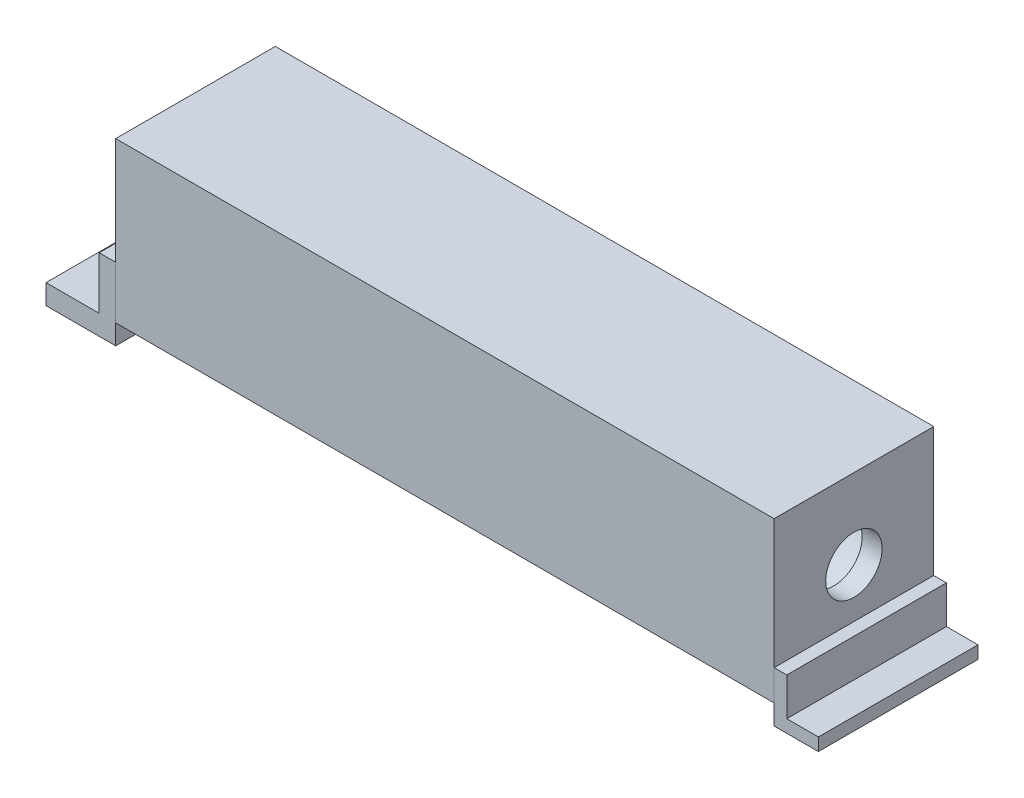
ISO-10303-21;
HEADER;
FILE_DESCRIPTION(('STEP AP214'),'2;1');
FILE_NAME('part.step','',(''),(''),'','','');
FILE_SCHEMA(('AUTOMOTIVE_DESIGN { 1 0 10303 214 1 1 1 1 }'));
ENDSEC;
DATA;
#1=APPLICATION_CONTEXT('core data for automotive mechanical design processes');
#2=APPLICATION_PROTOCOL_DEFINITION('international standard','automotive_design',2000,#1);
#3=PRODUCT_CONTEXT('',#1,'mechanical');
#4=PRODUCT('Part','Part','',(#3));
#5=PRODUCT_RELATED_PRODUCT_CATEGORY('part','',(#4));
#6=PRODUCT_DEFINITION_FORMATION('','',#4);
#7=PRODUCT_DEFINITION_CONTEXT('part definition',#1,'design');
#8=PRODUCT_DEFINITION('design','',#6,#7);
#9=PRODUCT_DEFINITION_SHAPE('','',#8);
#10=(LENGTH_UNIT() NAMED_UNIT(*) SI_UNIT(.MILLI.,.METRE.));
#11=(NAMED_UNIT(*) PLANE_ANGLE_UNIT() SI_UNIT($,.RADIAN.));
#12=(NAMED_UNIT(*) SI_UNIT($,.STERADIAN.) SOLID_ANGLE_UNIT());
#13=UNCERTAINTY_MEASURE_WITH_UNIT(LENGTH_MEASURE(1.E-05),#10,'distance_accuracy_value','');
#14=(GEOMETRIC_REPRESENTATION_CONTEXT(3) GLOBAL_UNCERTAINTY_ASSIGNED_CONTEXT((#13)) GLOBAL_UNIT_ASSIGNED_CONTEXT((#10,
#11,#12)) REPRESENTATION_CONTEXT('',''));
#15=CARTESIAN_POINT('',(0.,0.,0.));
#16=DIRECTION('',(0.,0.,1.));
#17=DIRECTION('',(1.,0.,0.));
#18=AXIS2_PLACEMENT_3D('',#15,#16,#17);
#19=CARTESIAN_POINT('',(610.,100.,130.));
#20=DIRECTION('',(0.,-1.,0.));
#21=DIRECTION('',(1.,0.,0.));
#22=AXIS2_PLACEMENT_3D('',#19,#20,#21);
#23=PLANE('',#22);
#24=DIRECTION('',(-1.,0.,0.));
#25=VECTOR('',#24,1.);
#26=CARTESIAN_POINT('',(621.0943429865,100.,130.));
#27=LINE('',#26,#25);
#28=CARTESIAN_POINT('',(632.188685973,100.,130.));
#29=VERTEX_POINT('',#28);
#30=CARTESIAN_POINT('',(610.,100.,130.));
#31=VERTEX_POINT('',#30);
#32=EDGE_CURVE('P0_E104',#29,#31,#27,.T.);
#33=ORIENTED_EDGE('',*,*,#32,.F.);
#34=DIRECTION('',(0.,0.,-1.));
#35=VECTOR('',#34,1.);
#36=CARTESIAN_POINT('',(632.188685973,100.,170.));
#37=LINE('',#36,#35);
#38=CARTESIAN_POINT('',(632.188685973,100.,210.));
#39=VERTEX_POINT('',#38);
#40=EDGE_CURVE('P0_E76',#39,#29,#37,.T.);
#41=ORIENTED_EDGE('',*,*,#40,.F.);
#42=DIRECTION('',(-1.,0.,0.));
#43=VECTOR('',#42,1.);
#44=CARTESIAN_POINT('',(621.0943429865,100.,210.));
#45=LINE('',#44,#43);
#46=CARTESIAN_POINT('',(610.,100.,210.));
#47=VERTEX_POINT('',#46);
#48=EDGE_CURVE('P0_E73',#39,#47,#45,.T.);
#49=ORIENTED_EDGE('',*,*,#48,.T.);
#50=DIRECTION('',(0.,0.,1.));
#51=VECTOR('',#50,1.);
#52=CARTESIAN_POINT('',(610.,100.,170.));
#53=LINE('',#52,#51);
#54=EDGE_CURVE('P0_E21',#31,#47,#53,.T.);
#55=ORIENTED_EDGE('',*,*,#54,.F.);
#56=EDGE_LOOP('',(#33,#41,#49,#55));
#57=FACE_BOUND('',#56,.T.);
#58=ADVANCED_FACE('P0_F17',(#57),#23,.T.);
#59=CARTESIAN_POINT('',(610.,100.,130.));
#60=DIRECTION('',(-1.,0.,0.));
#61=DIRECTION('',(0.,0.,1.));
#62=AXIS2_PLACEMENT_3D('',#59,#60,#61);
#63=PLANE('',#62);
#64=DIRECTION('',(0.,1.,0.));
#65=VECTOR('',#64,1.);
#66=CARTESIAN_POINT('',(610.,112.672595784,130.));
#67=LINE('',#66,#65);
#68=CARTESIAN_POINT('',(610.,125.345191568,130.));
#69=VERTEX_POINT('',#68);
#70=EDGE_CURVE('P0_E83',#31,#69,#67,.T.);
#71=ORIENTED_EDGE('',*,*,#70,.F.);
#72=ORIENTED_EDGE('',*,*,#54,.T.);
#73=DIRECTION('',(0.,1.,0.));
#74=VECTOR('',#73,1.);
#75=CARTESIAN_POINT('',(610.,112.672595784,210.));
#76=LINE('',#75,#74);
#77=CARTESIAN_POINT('',(610.,125.345191568,210.));
#78=VERTEX_POINT('',#77);
#79=EDGE_CURVE('P0_E68',#47,#78,#76,.T.);
#80=ORIENTED_EDGE('',*,*,#79,.T.);
#81=DIRECTION('',(0.,0.,1.));
#82=VECTOR('',#81,1.);
#83=CARTESIAN_POINT('',(610.,125.345191568,170.));
#84=LINE('',#83,#82);
#85=EDGE_CURVE('P0_E79',#69,#78,#84,.T.);
#86=ORIENTED_EDGE('',*,*,#85,.F.);
#87=EDGE_LOOP('',(#71,#72,#80,#86));
#88=FACE_BOUND('',#87,.T.);
#89=ADVANCED_FACE('P0_F81',(#88),#63,.T.);
#90=CARTESIAN_POINT('',(610.,125.345191568,130.));
#91=DIRECTION('',(0.,1.,0.));
#92=DIRECTION('',(0.,0.,1.));
#93=AXIS2_PLACEMENT_3D('',#90,#91,#92);
#94=PLANE('',#93);
#95=DIRECTION('',(1.,0.,0.));
#96=VECTOR('',#95,1.);
#97=CARTESIAN_POINT('',(621.0943429865,125.345191568,130.));
#98=LINE('',#97,#96);
#99=CARTESIAN_POINT('',(616.35580582031,125.345191568,130.));
#100=VERTEX_POINT('',#99);
#101=EDGE_CURVE('P0_E97',#69,#100,#98,.T.);
#102=ORIENTED_EDGE('',*,*,#101,.F.);
#103=ORIENTED_EDGE('',*,*,#85,.T.);
#104=DIRECTION('',(1.,0.,0.));
#105=VECTOR('',#104,1.);
#106=CARTESIAN_POINT('',(621.0943429865,125.345191568,210.));
#107=LINE('',#106,#105);
#108=CARTESIAN_POINT('',(616.35580582031,125.345191568,210.));
#109=VERTEX_POINT('',#108);
#110=EDGE_CURVE('P0_E88',#78,#109,#107,.T.);
#111=ORIENTED_EDGE('',*,*,#110,.T.);
#112=DIRECTION('',(0.,0.,1.));
#113=VECTOR('',#112,1.);
#114=CARTESIAN_POINT('',(616.355805816,125.345191568,170.));
#115=LINE('',#114,#113);
#116=EDGE_CURVE('P0_E99',#100,#109,#115,.T.);
#117=ORIENTED_EDGE('',*,*,#116,.F.);
#118=EDGE_LOOP('',(#102,#103,#111,#117));
#119=FACE_BOUND('',#118,.T.);
#120=ADVANCED_FACE('P0_F95',(#119),#94,.T.);
#121=CARTESIAN_POINT('',(632.188685973,100.,210.));
#122=DIRECTION('',(0.,0.,-1.));
#123=DIRECTION('',(-1.,0.,0.));
#124=AXIS2_PLACEMENT_3D('',#121,#122,#123);
#125=PLANE('',#124);
#126=DIRECTION('',(0.,-1.,0.));
#127=VECTOR('',#126,1.);
#128=CARTESIAN_POINT('',(616.355805816,115.8491235195,210.));
#129=LINE('',#128,#127);
#130=CARTESIAN_POINT('',(616.35580582031,106.353055472345,210.));
#131=VERTEX_POINT('',#130);
#132=EDGE_CURVE('P0_E100',#109,#131,#129,.T.);
#133=ORIENTED_EDGE('',*,*,#132,.F.);
#134=ORIENTED_EDGE('',*,*,#110,.F.);
#135=ORIENTED_EDGE('',*,*,#79,.F.);
#136=ORIENTED_EDGE('',*,*,#48,.F.);
#137=DIRECTION('',(0.,-1.,0.));
#138=VECTOR('',#137,1.);
#139=CARTESIAN_POINT('',(632.188685973,103.1765277355,210.));
#140=LINE('',#139,#138);
#141=CARTESIAN_POINT('',(632.188685973,106.353055472345,210.));
#142=VERTEX_POINT('',#141);
#143=EDGE_CURVE('P0_E90',#142,#39,#140,.T.);
#144=ORIENTED_EDGE('',*,*,#143,.F.);
#145=DIRECTION('',(1.,0.,0.));
#146=VECTOR('',#145,1.);
#147=CARTESIAN_POINT('',(624.2722458945,106.353055471,210.));
#148=LINE('',#147,#146);
#149=EDGE_CURVE('P0_E117',#131,#142,#148,.T.);
#150=ORIENTED_EDGE('',*,*,#149,.F.);
#151=EDGE_LOOP('',(#133,#134,#135,#136,#144,#150));
#152=FACE_BOUND('',#151,.T.);
#153=ADVANCED_FACE('P0_F87',(#152),#125,.F.);
#154=CARTESIAN_POINT('',(632.188685973,100.,210.));
#155=DIRECTION('',(1.,0.,0.));
#156=DIRECTION('',(0.,0.,-1.));
#157=AXIS2_PLACEMENT_3D('',#154,#155,#156);
#158=PLANE('',#157);
#159=DIRECTION('',(0.,-1.,0.));
#160=VECTOR('',#159,1.);
#161=CARTESIAN_POINT('',(632.188685973,112.672595784,130.));
#162=LINE('',#161,#160);
#163=CARTESIAN_POINT('',(632.188685973,106.353055471672,130.));
#164=VERTEX_POINT('',#163);
#165=EDGE_CURVE('P0_E106',#164,#29,#162,.T.);
#166=ORIENTED_EDGE('',*,*,#165,.F.);
#167=DIRECTION('',(0.,0.,-1.));
#168=VECTOR('',#167,1.);
#169=CARTESIAN_POINT('',(632.188685973,106.353055471,170.));
#170=LINE('',#169,#168);
#171=EDGE_CURVE('P0_E115',#142,#164,#170,.T.);
#172=ORIENTED_EDGE('',*,*,#171,.F.);
#173=ORIENTED_EDGE('',*,*,#143,.T.);
#174=ORIENTED_EDGE('',*,*,#40,.T.);
#175=EDGE_LOOP('',(#166,#172,#173,#174));
#176=FACE_BOUND('',#175,.T.);
#177=ADVANCED_FACE('P0_F113',(#176),#158,.T.);
#178=CARTESIAN_POINT('',(632.188685973,100.,130.));
#179=DIRECTION('',(0.,0.,-1.));
#180=DIRECTION('',(-1.,0.,0.));
#181=AXIS2_PLACEMENT_3D('',#178,#179,#180);
#182=PLANE('',#181);
#183=ORIENTED_EDGE('',*,*,#101,.T.);
#184=DIRECTION('',(0.,1.,0.));
#185=VECTOR('',#184,1.);
#186=CARTESIAN_POINT('',(616.355805816,115.8491235195,130.));
#187=LINE('',#186,#185);
#188=CARTESIAN_POINT('',(616.35580582031,106.353055472345,130.));
#189=VERTEX_POINT('',#188);
#190=EDGE_CURVE('P0_E36',#189,#100,#187,.T.);
#191=ORIENTED_EDGE('',*,*,#190,.F.);
#192=DIRECTION('',(-1.,0.,0.));
#193=VECTOR('',#192,1.);
#194=CARTESIAN_POINT('',(624.2722458945,106.353055471,130.));
#195=LINE('',#194,#193);
#196=EDGE_CURVE('P0_E27',#164,#189,#195,.T.);
#197=ORIENTED_EDGE('',*,*,#196,.F.);
#198=ORIENTED_EDGE('',*,*,#165,.T.);
#199=ORIENTED_EDGE('',*,*,#32,.T.);
#200=ORIENTED_EDGE('',*,*,#70,.T.);
#201=EDGE_LOOP('',(#183,#191,#197,#198,#199,#200));
#202=FACE_BOUND('',#201,.T.);
#203=ADVANCED_FACE('P0_F102',(#202),#182,.T.);
#204=CARTESIAN_POINT('',(616.355805816,106.353055471,210.));
#205=DIRECTION('',(1.,0.,0.));
#206=DIRECTION('',(0.,0.,-1.));
#207=AXIS2_PLACEMENT_3D('',#204,#205,#206);
#208=PLANE('',#207);
#209=ORIENTED_EDGE('',*,*,#190,.T.);
#210=ORIENTED_EDGE('',*,*,#116,.T.);
#211=ORIENTED_EDGE('',*,*,#132,.T.);
#212=DIRECTION('',(0.,0.,1.));
#213=VECTOR('',#212,1.);
#214=CARTESIAN_POINT('',(616.355805816,106.353055471,170.));
#215=LINE('',#214,#213);
#216=EDGE_CURVE('P0_E11',#189,#131,#215,.T.);
#217=ORIENTED_EDGE('',*,*,#216,.F.);
#218=EDGE_LOOP('',(#209,#210,#211,#217));
#219=FACE_BOUND('',#218,.T.);
#220=ADVANCED_FACE('P0_F122',(#219),#208,.T.);
#221=CARTESIAN_POINT('',(616.355805816,106.353055471,130.));
#222=DIRECTION('',(0.,1.,0.));
#223=DIRECTION('',(0.,0.,1.));
#224=AXIS2_PLACEMENT_3D('',#221,#222,#223);
#225=PLANE('',#224);
#226=ORIENTED_EDGE('',*,*,#196,.T.);
#227=ORIENTED_EDGE('',*,*,#216,.T.);
#228=ORIENTED_EDGE('',*,*,#149,.T.);
#229=ORIENTED_EDGE('',*,*,#171,.T.);
#230=EDGE_LOOP('',(#226,#227,#228,#229));
#231=FACE_BOUND('',#230,.T.);
#232=ADVANCED_FACE('P0_F19',(#231),#225,.T.);
#233=CLOSED_SHELL('',(#58,#89,#120,#153,#177,#203,#220,#232));
#234=MANIFOLD_SOLID_BREP('P0_B1',#233);
#235=CARTESIAN_POINT('',(245.056426343,110.,130.));
#236=DIRECTION('',(0.,-1.,0.));
#237=DIRECTION('',(1.,0.,0.));
#238=AXIS2_PLACEMENT_3D('',#235,#236,#237);
#239=PLANE('',#238);
#240=DIRECTION('',(0.,0.,-1.));
#241=VECTOR('',#240,1.);
#242=CARTESIAN_POINT('',(271.738370692,110.,170.));
#243=LINE('',#242,#241);
#244=CARTESIAN_POINT('',(271.738370691849,109.999999996395,210.));
#245=VERTEX_POINT('',#244);
#246=CARTESIAN_POINT('',(271.738370691849,109.999999996395,130.));
#247=VERTEX_POINT('',#246);
#248=EDGE_CURVE('P1_E73',#245,#247,#243,.T.);
#249=ORIENTED_EDGE('',*,*,#248,.T.);
#250=DIRECTION('',(-1.,0.,0.));
#251=VECTOR('',#250,1.);
#252=CARTESIAN_POINT('',(262.5282131715,109.999999985582,130.));
#253=LINE('',#252,#251);
#254=CARTESIAN_POINT('',(245.056426343,109.999999996395,130.));
#255=VERTEX_POINT('',#254);
#256=EDGE_CURVE('P1_E75',#247,#255,#253,.T.);
#257=ORIENTED_EDGE('',*,*,#256,.T.);
#258=DIRECTION('',(0.,0.,1.));
#259=VECTOR('',#258,1.);
#260=CARTESIAN_POINT('',(245.056426343,110.,170.));
#261=LINE('',#260,#259);
#262=CARTESIAN_POINT('',(245.056426343,109.999999996395,210.));
#263=VERTEX_POINT('',#262);
#264=EDGE_CURVE('P1_E21',#255,#263,#261,.T.);
#265=ORIENTED_EDGE('',*,*,#264,.T.);
#266=DIRECTION('',(-1.,0.,0.));
#267=VECTOR('',#266,1.);
#268=CARTESIAN_POINT('',(262.5282131715,109.999999985582,210.));
#269=LINE('',#268,#267);
#270=EDGE_CURVE('P1_E76',#245,#263,#269,.T.);
#271=ORIENTED_EDGE('',*,*,#270,.F.);
#272=EDGE_LOOP('',(#249,#257,#265,#271));
#273=FACE_BOUND('',#272,.T.);
#274=ADVANCED_FACE('P1_F17',(#273),#239,.F.);
#275=CARTESIAN_POINT('',(245.056426343,100.,210.));
#276=DIRECTION('',(1.,0.,0.));
#277=DIRECTION('',(0.,0.,-1.));
#278=AXIS2_PLACEMENT_3D('',#275,#276,#277);
#279=PLANE('',#278);
#280=ORIENTED_EDGE('',*,*,#264,.F.);
#281=DIRECTION('',(0.,-1.,0.));
#282=VECTOR('',#281,1.);
#283=CARTESIAN_POINT('',(245.056426343,118.149067141,130.));
#284=LINE('',#283,#282);
#285=CARTESIAN_POINT('',(245.056426343,100.,130.));
#286=VERTEX_POINT('',#285);
#287=EDGE_CURVE('P1_E90',#255,#286,#284,.T.);
#288=ORIENTED_EDGE('',*,*,#287,.T.);
#289=DIRECTION('',(0.,0.,1.));
#290=VECTOR('',#289,1.);
#291=CARTESIAN_POINT('',(245.056426343,100.,170.));
#292=LINE('',#291,#290);
#293=CARTESIAN_POINT('',(245.056426343,100.,210.));
#294=VERTEX_POINT('',#293);
#295=EDGE_CURVE('P1_E82',#286,#294,#292,.T.);
#296=ORIENTED_EDGE('',*,*,#295,.T.);
#297=DIRECTION('',(0.,-1.,0.));
#298=VECTOR('',#297,1.);
#299=CARTESIAN_POINT('',(245.056426343,118.149067141,210.));
#300=LINE('',#299,#298);
#301=EDGE_CURVE('P1_E99',#263,#294,#300,.T.);
#302=ORIENTED_EDGE('',*,*,#301,.F.);
#303=EDGE_LOOP('',(#280,#288,#296,#302));
#304=FACE_BOUND('',#303,.T.);
#305=ADVANCED_FACE('P1_F100',(#304),#279,.F.);
#306=CARTESIAN_POINT('',(245.056426343,100.,130.));
#307=DIRECTION('',(0.,1.,0.));
#308=DIRECTION('',(0.,0.,1.));
#309=AXIS2_PLACEMENT_3D('',#306,#307,#308);
#310=PLANE('',#309);
#311=ORIENTED_EDGE('',*,*,#295,.F.);
#312=DIRECTION('',(1.,0.,0.));
#313=VECTOR('',#312,1.);
#314=CARTESIAN_POINT('',(262.5282131715,100.,130.));
#315=LINE('',#314,#313);
#316=CARTESIAN_POINT('',(280.,100.,130.));
#317=VERTEX_POINT('',#316);
#318=EDGE_CURVE('P1_E114',#286,#317,#315,.T.);
#319=ORIENTED_EDGE('',*,*,#318,.T.);
#320=DIRECTION('',(0.,0.,1.));
#321=VECTOR('',#320,1.);
#322=CARTESIAN_POINT('',(280.,100.,170.));
#323=LINE('',#322,#321);
#324=CARTESIAN_POINT('',(280.,100.,210.));
#325=VERTEX_POINT('',#324);
#326=EDGE_CURVE('P1_E109',#317,#325,#323,.T.);
#327=ORIENTED_EDGE('',*,*,#326,.T.);
#328=DIRECTION('',(1.,0.,0.));
#329=VECTOR('',#328,1.);
#330=CARTESIAN_POINT('',(262.5282131715,100.,210.));
#331=LINE('',#330,#329);
#332=EDGE_CURVE('P1_E101',#294,#325,#331,.T.);
#333=ORIENTED_EDGE('',*,*,#332,.F.);
#334=EDGE_LOOP('',(#311,#319,#327,#333));
#335=FACE_BOUND('',#334,.T.);
#336=ADVANCED_FACE('P1_F117',(#335),#310,.F.);
#337=CARTESIAN_POINT('',(271.738370692,110.,210.));
#338=DIRECTION('',(1.,0.,0.));
#339=DIRECTION('',(0.,0.,-1.));
#340=AXIS2_PLACEMENT_3D('',#337,#338,#339);
#341=PLANE('',#340);
#342=DIRECTION('',(0.,0.,-1.));
#343=VECTOR('',#342,1.);
#344=CARTESIAN_POINT('',(271.738370692,136.298134282,170.));
#345=LINE('',#344,#343);
#346=CARTESIAN_POINT('',(271.738370691849,136.298134282,210.));
#347=VERTEX_POINT('',#346);
#348=CARTESIAN_POINT('',(271.738370691849,136.298134282,130.));
#349=VERTEX_POINT('',#348);
#350=EDGE_CURVE('P1_E94',#347,#349,#345,.T.);
#351=ORIENTED_EDGE('',*,*,#350,.T.);
#352=DIRECTION('',(0.,-1.,0.));
#353=VECTOR('',#352,1.);
#354=CARTESIAN_POINT('',(271.738370691398,118.149067141,130.));
#355=LINE('',#354,#353);
#356=EDGE_CURVE('P1_E81',#349,#247,#355,.T.);
#357=ORIENTED_EDGE('',*,*,#356,.T.);
#358=ORIENTED_EDGE('',*,*,#248,.F.);
#359=DIRECTION('',(0.,-1.,0.));
#360=VECTOR('',#359,1.);
#361=CARTESIAN_POINT('',(271.738370691398,118.149067141,210.));
#362=LINE('',#361,#360);
#363=EDGE_CURVE('P1_E104',#347,#245,#362,.T.);
#364=ORIENTED_EDGE('',*,*,#363,.F.);
#365=EDGE_LOOP('',(#351,#357,#358,#364));
#366=FACE_BOUND('',#365,.T.);
#367=ADVANCED_FACE('P1_F93',(#366),#341,.F.);
#368=CARTESIAN_POINT('',(245.056426343,100.,130.));
#369=DIRECTION('',(0.,0.,1.));
#370=DIRECTION('',(1.,0.,0.));
#371=AXIS2_PLACEMENT_3D('',#368,#369,#370);
#372=PLANE('',#371);
#373=DIRECTION('',(0.,-1.,0.));
#374=VECTOR('',#373,1.);
#375=CARTESIAN_POINT('',(280.,118.149067141,130.));
#376=LINE('',#375,#374);
#377=CARTESIAN_POINT('',(280.,136.298134282,130.));
#378=VERTEX_POINT('',#377);
#379=EDGE_CURVE('P1_E112',#378,#317,#376,.T.);
#380=ORIENTED_EDGE('',*,*,#379,.T.);
#381=ORIENTED_EDGE('',*,*,#318,.F.);
#382=ORIENTED_EDGE('',*,*,#287,.F.);
#383=ORIENTED_EDGE('',*,*,#256,.F.);
#384=ORIENTED_EDGE('',*,*,#356,.F.);
#385=DIRECTION('',(1.,0.,0.));
#386=VECTOR('',#385,1.);
#387=CARTESIAN_POINT('',(275.869185346,136.298134282,130.));
#388=LINE('',#387,#386);
#389=EDGE_CURVE('P1_E122',#349,#378,#388,.T.);
#390=ORIENTED_EDGE('',*,*,#389,.T.);
#391=EDGE_LOOP('',(#380,#381,#382,#383,#384,#390));
#392=FACE_BOUND('',#391,.T.);
#393=ADVANCED_FACE('P1_F86',(#392),#372,.F.);
#394=CARTESIAN_POINT('',(280.,136.298134282,130.));
#395=DIRECTION('',(-1.,0.,0.));
#396=DIRECTION('',(0.,-1.,0.));
#397=AXIS2_PLACEMENT_3D('',#394,#395,#396);
#398=PLANE('',#397);
#399=ORIENTED_EDGE('',*,*,#326,.F.);
#400=ORIENTED_EDGE('',*,*,#379,.F.);
#401=DIRECTION('',(0.,0.,1.));
#402=VECTOR('',#401,1.);
#403=CARTESIAN_POINT('',(280.,136.298134282,170.));
#404=LINE('',#403,#402);
#405=CARTESIAN_POINT('',(280.,136.298134282,210.));
#406=VERTEX_POINT('',#405);
#407=EDGE_CURVE('P1_E27',#378,#406,#404,.T.);
#408=ORIENTED_EDGE('',*,*,#407,.T.);
#409=DIRECTION('',(0.,1.,0.));
#410=VECTOR('',#409,1.);
#411=CARTESIAN_POINT('',(280.,118.149067141,210.));
#412=LINE('',#411,#410);
#413=EDGE_CURVE('P1_E35',#325,#406,#412,.T.);
#414=ORIENTED_EDGE('',*,*,#413,.F.);
#415=EDGE_LOOP('',(#399,#400,#408,#414));
#416=FACE_BOUND('',#415,.T.);
#417=ADVANCED_FACE('P1_F119',(#416),#398,.F.);
#418=CARTESIAN_POINT('',(245.056426343,100.,210.));
#419=DIRECTION('',(0.,0.,1.));
#420=DIRECTION('',(1.,0.,0.));
#421=AXIS2_PLACEMENT_3D('',#418,#419,#420);
#422=PLANE('',#421);
#423=ORIENTED_EDGE('',*,*,#332,.T.);
#424=ORIENTED_EDGE('',*,*,#413,.T.);
#425=DIRECTION('',(-1.,0.,0.));
#426=VECTOR('',#425,1.);
#427=CARTESIAN_POINT('',(275.869185346,136.298134282,210.));
#428=LINE('',#427,#426);
#429=EDGE_CURVE('P1_E11',#406,#347,#428,.T.);
#430=ORIENTED_EDGE('',*,*,#429,.T.);
#431=ORIENTED_EDGE('',*,*,#363,.T.);
#432=ORIENTED_EDGE('',*,*,#270,.T.);
#433=ORIENTED_EDGE('',*,*,#301,.T.);
#434=EDGE_LOOP('',(#423,#424,#430,#431,#432,#433));
#435=FACE_BOUND('',#434,.T.);
#436=ADVANCED_FACE('P1_F127',(#435),#422,.T.);
#437=CARTESIAN_POINT('',(271.738370692,136.298134282,210.));
#438=DIRECTION('',(0.,-1.,0.));
#439=DIRECTION('',(0.,0.,-1.));
#440=AXIS2_PLACEMENT_3D('',#437,#438,#439);
#441=PLANE('',#440);
#442=ORIENTED_EDGE('',*,*,#407,.F.);
#443=ORIENTED_EDGE('',*,*,#389,.F.);
#444=ORIENTED_EDGE('',*,*,#350,.F.);
#445=ORIENTED_EDGE('',*,*,#429,.F.);
#446=EDGE_LOOP('',(#442,#443,#444,#445));
#447=FACE_BOUND('',#446,.T.);
#448=ADVANCED_FACE('P1_F19',(#447),#441,.F.);
#449=CLOSED_SHELL('',(#274,#305,#336,#367,#393,#417,#436,#448));
#450=MANIFOLD_SOLID_BREP('P1_B1',#449);
#451=CARTESIAN_POINT('',(280.,110.,210.));
#452=DIRECTION('',(1.,0.,0.));
#453=DIRECTION('',(0.,0.,-1.));
#454=AXIS2_PLACEMENT_3D('',#451,#452,#453);
#455=PLANE('',#454);
#456=DIRECTION('',(0.,0.,-1.));
#457=VECTOR('',#456,1.);
#458=CARTESIAN_POINT('',(280.,190.,170.));
#459=LINE('',#458,#457);
#460=CARTESIAN_POINT('',(280.,190.,210.));
#461=VERTEX_POINT('',#460);
#462=CARTESIAN_POINT('',(280.,190.,130.));
#463=VERTEX_POINT('',#462);
#464=EDGE_CURVE('P2_E99',#461,#463,#459,.T.);
#465=ORIENTED_EDGE('',*,*,#464,.T.);
#466=DIRECTION('',(0.,-1.,0.));
#467=VECTOR('',#466,1.);
#468=CARTESIAN_POINT('',(280.,150.,130.));
#469=LINE('',#468,#467);
#470=CARTESIAN_POINT('',(280.,110.,130.));
#471=VERTEX_POINT('',#470);
#472=EDGE_CURVE('P2_E75',#463,#471,#469,.T.);
#473=ORIENTED_EDGE('',*,*,#472,.T.);
#474=DIRECTION('',(0.,0.,1.));
#475=VECTOR('',#474,1.);
#476=CARTESIAN_POINT('',(280.,110.,170.));
#477=LINE('',#476,#475);
#478=CARTESIAN_POINT('',(280.,110.,210.));
#479=VERTEX_POINT('',#478);
#480=EDGE_CURVE('P2_E57',#471,#479,#477,.T.);
#481=ORIENTED_EDGE('',*,*,#480,.T.);
#482=DIRECTION('',(0.,1.,0.));
#483=VECTOR('',#482,1.);
#484=CARTESIAN_POINT('',(280.,150.,210.));
#485=LINE('',#484,#483);
#486=EDGE_CURVE('P2_E63',#479,#461,#485,.T.);
#487=ORIENTED_EDGE('',*,*,#486,.T.);
#488=EDGE_LOOP('',(#465,#473,#481,#487));
#489=FACE_BOUND('',#488,.T.);
#490=ADVANCED_FACE('P2_F17',(#489),#455,.F.);
#491=CARTESIAN_POINT('',(610.,110.,210.));
#492=DIRECTION('',(0.,0.,-1.));
#493=DIRECTION('',(-1.,0.,0.));
#494=AXIS2_PLACEMENT_3D('',#491,#492,#493);
#495=PLANE('',#494);
#496=ORIENTED_EDGE('',*,*,#486,.F.);
#497=DIRECTION('',(1.,0.,0.));
#498=VECTOR('',#497,1.);
#499=CARTESIAN_POINT('',(445.,110.,210.));
#500=LINE('',#499,#498);
#501=CARTESIAN_POINT('',(610.,110.,210.));
#502=VERTEX_POINT('',#501);
#503=EDGE_CURVE('P2_E66',#479,#502,#500,.T.);
#504=ORIENTED_EDGE('',*,*,#503,.T.);
#505=DIRECTION('',(0.,-1.,0.));
#506=VECTOR('',#505,1.);
#507=CARTESIAN_POINT('',(610.,150.,210.));
#508=LINE('',#507,#506);
#509=CARTESIAN_POINT('',(610.,190.,210.));
#510=VERTEX_POINT('',#509);
#511=EDGE_CURVE('P2_E95',#510,#502,#508,.T.);
#512=ORIENTED_EDGE('',*,*,#511,.F.);
#513=DIRECTION('',(-1.,0.,0.));
#514=VECTOR('',#513,1.);
#515=CARTESIAN_POINT('',(445.,190.,210.));
#516=LINE('',#515,#514);
#517=EDGE_CURVE('P2_E68',#510,#461,#516,.T.);
#518=ORIENTED_EDGE('',*,*,#517,.T.);
#519=EDGE_LOOP('',(#496,#504,#512,#518));
#520=FACE_BOUND('',#519,.T.);
#521=ADVANCED_FACE('P2_F64',(#520),#495,.F.);
#522=CARTESIAN_POINT('',(280.,110.,130.));
#523=DIRECTION('',(0.,1.,0.));
#524=DIRECTION('',(0.,0.,1.));
#525=AXIS2_PLACEMENT_3D('',#522,#523,#524);
#526=PLANE('',#525);
#527=ORIENTED_EDGE('',*,*,#480,.F.);
#528=DIRECTION('',(1.,0.,0.));
#529=VECTOR('',#528,1.);
#530=CARTESIAN_POINT('',(445.,110.,130.));
#531=LINE('',#530,#529);
#532=CARTESIAN_POINT('',(610.,110.,130.));
#533=VERTEX_POINT('',#532);
#534=EDGE_CURVE('P2_E102',#471,#533,#531,.T.);
#535=ORIENTED_EDGE('',*,*,#534,.T.);
#536=DIRECTION('',(0.,0.,-1.));
#537=VECTOR('',#536,1.);
#538=CARTESIAN_POINT('',(610.,110.,170.));
#539=LINE('',#538,#537);
#540=EDGE_CURVE('P2_E74',#502,#533,#539,.T.);
#541=ORIENTED_EDGE('',*,*,#540,.F.);
#542=ORIENTED_EDGE('',*,*,#503,.F.);
#543=EDGE_LOOP('',(#527,#535,#541,#542));
#544=FACE_BOUND('',#543,.T.);
#545=ADVANCED_FACE('P2_F73',(#544),#526,.F.);
#546=CARTESIAN_POINT('',(280.,110.,130.));
#547=DIRECTION('',(0.,0.,1.));
#548=DIRECTION('',(1.,0.,0.));
#549=AXIS2_PLACEMENT_3D('',#546,#547,#548);
#550=PLANE('',#549);
#551=ORIENTED_EDGE('',*,*,#472,.F.);
#552=DIRECTION('',(1.,0.,0.));
#553=VECTOR('',#552,1.);
#554=CARTESIAN_POINT('',(445.,190.,130.));
#555=LINE('',#554,#553);
#556=CARTESIAN_POINT('',(610.,190.,130.));
#557=VERTEX_POINT('',#556);
#558=EDGE_CURVE('P2_E97',#463,#557,#555,.T.);
#559=ORIENTED_EDGE('',*,*,#558,.T.);
#560=DIRECTION('',(0.,1.,0.));
#561=VECTOR('',#560,1.);
#562=CARTESIAN_POINT('',(610.,150.,130.));
#563=LINE('',#562,#561);
#564=EDGE_CURVE('P2_E36',#533,#557,#563,.T.);
#565=ORIENTED_EDGE('',*,*,#564,.F.);
#566=ORIENTED_EDGE('',*,*,#534,.F.);
#567=EDGE_LOOP('',(#551,#559,#565,#566));
#568=FACE_BOUND('',#567,.T.);
#569=ADVANCED_FACE('P2_F104',(#568),#550,.F.);
#570=CARTESIAN_POINT('',(280.,190.,210.));
#571=DIRECTION('',(0.,-1.,0.));
#572=DIRECTION('',(0.,0.,-1.));
#573=AXIS2_PLACEMENT_3D('',#570,#571,#572);
#574=PLANE('',#573);
#575=ORIENTED_EDGE('',*,*,#464,.F.);
#576=ORIENTED_EDGE('',*,*,#517,.F.);
#577=DIRECTION('',(0.,0.,1.));
#578=VECTOR('',#577,1.);
#579=CARTESIAN_POINT('',(610.,190.,170.));
#580=LINE('',#579,#578);
#581=EDGE_CURVE('P2_E87',#557,#510,#580,.T.);
#582=ORIENTED_EDGE('',*,*,#581,.F.);
#583=ORIENTED_EDGE('',*,*,#558,.F.);
#584=EDGE_LOOP('',(#575,#576,#582,#583));
#585=FACE_BOUND('',#584,.T.);
#586=ADVANCED_FACE('P2_F107',(#585),#574,.F.);
#587=CARTESIAN_POINT('',(610.,110.,210.));
#588=DIRECTION('',(1.,0.,0.));
#589=DIRECTION('',(0.,0.,-1.));
#590=AXIS2_PLACEMENT_3D('',#587,#588,#589);
#591=PLANE('',#590);
#592=CARTESIAN_POINT('',(610.,150.,170.));
#593=DIRECTION('',(-1.,0.,0.));
#594=DIRECTION('',(0.,-1.,0.));
#595=AXIS2_PLACEMENT_3D('',#592,#593,#594);
#596=CIRCLE('',#595,14.142135624);
#597=CARTESIAN_POINT('',(610.,135.857864376,170.));
#598=VERTEX_POINT('',#597);
#599=EDGE_CURVE('P2_E21',#598,#598,#596,.F.);
#600=ORIENTED_EDGE('',*,*,#599,.F.);
#601=EDGE_LOOP('',(#600));
#602=FACE_BOUND('',#601,.T.);
#603=ORIENTED_EDGE('',*,*,#564,.T.);
#604=ORIENTED_EDGE('',*,*,#581,.T.);
#605=ORIENTED_EDGE('',*,*,#511,.T.);
#606=ORIENTED_EDGE('',*,*,#540,.T.);
#607=EDGE_LOOP('',(#603,#604,#605,#606));
#608=FACE_BOUND('',#607,.T.);
#609=ADVANCED_FACE('P2_F109',(#602,#608),#591,.T.);
#610=CARTESIAN_POINT('',(610.,150.,170.));
#611=DIRECTION('',(-1.,0.,0.));
#612=DIRECTION('',(0.,-1.,0.));
#613=AXIS2_PLACEMENT_3D('',#610,#611,#612);
#614=CYLINDRICAL_SURFACE('',#613,14.142135624);
#615=CARTESIAN_POINT('',(600.,150.,170.));
#616=DIRECTION('',(-1.,0.,0.));
#617=DIRECTION('',(0.,-1.,0.));
#618=AXIS2_PLACEMENT_3D('',#615,#616,#617);
#619=CIRCLE('',#618,14.142135624);
#620=CARTESIAN_POINT('',(600.,135.857864376,170.));
#621=VERTEX_POINT('',#620);
#622=EDGE_CURVE('P2_E82',#621,#621,#619,.T.);
#623=ORIENTED_EDGE('',*,*,#622,.T.);
#624=EDGE_LOOP('',(#623));
#625=FACE_BOUND('',#624,.T.);
#626=ORIENTED_EDGE('',*,*,#599,.T.);
#627=EDGE_LOOP('',(#626));
#628=FACE_BOUND('',#627,.T.);
#629=ADVANCED_FACE('P2_F116',(#625,#628),#614,.F.);
#630=CARTESIAN_POINT('',(600.,119.64,200.36));
#631=DIRECTION('',(1.,0.,0.));
#632=DIRECTION('',(0.,0.,-1.));
#633=AXIS2_PLACEMENT_3D('',#630,#631,#632);
#634=PLANE('',#633);
#635=ORIENTED_EDGE('',*,*,#622,.F.);
#636=EDGE_LOOP('',(#635));
#637=FACE_BOUND('',#636,.T.);
#638=CARTESIAN_POINT('',(600.,150.,170.));
#639=DIRECTION('',(-1.,0.,0.));
#640=DIRECTION('',(0.,0.,1.));
#641=AXIS2_PLACEMENT_3D('',#638,#639,#640);
#642=CIRCLE('',#641,30.);
#643=CARTESIAN_POINT('',(600.,150.,200.));
#644=VERTEX_POINT('',#643);
#645=EDGE_CURVE('P2_E27',#644,#644,#642,.F.);
#646=ORIENTED_EDGE('',*,*,#645,.F.);
#647=EDGE_LOOP('',(#646));
#648=FACE_BOUND('',#647,.T.);
#649=ADVANCED_FACE('P2_F127',(#637,#648),#634,.F.);
#650=CARTESIAN_POINT('',(290.,119.64,200.36));
#651=DIRECTION('',(1.,0.,0.));
#652=DIRECTION('',(0.,0.,-1.));
#653=AXIS2_PLACEMENT_3D('',#650,#651,#652);
#654=PLANE('',#653);
#655=CARTESIAN_POINT('',(290.,150.,170.));
#656=DIRECTION('',(-1.,0.,0.));
#657=DIRECTION('',(0.,0.,1.));
#658=AXIS2_PLACEMENT_3D('',#655,#656,#657);
#659=CIRCLE('',#658,30.);
#660=CARTESIAN_POINT('',(290.,150.,200.));
#661=VERTEX_POINT('',#660);
#662=EDGE_CURVE('P2_E11',#661,#661,#659,.T.);
#663=ORIENTED_EDGE('',*,*,#662,.F.);
#664=EDGE_LOOP('',(#663));
#665=FACE_BOUND('',#664,.T.);
#666=ADVANCED_FACE('P2_F19',(#665),#654,.T.);
#667=CARTESIAN_POINT('',(600.,150.,170.));
#668=DIRECTION('',(-1.,0.,0.));
#669=DIRECTION('',(0.,0.,1.));
#670=AXIS2_PLACEMENT_3D('',#667,#668,#669);
#671=CYLINDRICAL_SURFACE('',#670,30.);
#672=ORIENTED_EDGE('',*,*,#662,.T.);
#673=EDGE_LOOP('',(#672));
#674=FACE_BOUND('',#673,.T.);
#675=ORIENTED_EDGE('',*,*,#645,.T.);
#676=EDGE_LOOP('',(#675));
#677=FACE_BOUND('',#676,.T.);
#678=ADVANCED_FACE('P2_F120',(#674,#677),#671,.F.);
#679=CLOSED_SHELL('',(#490,#521,#545,#569,#586,#609,#629,#649,#666,#678));
#680=MANIFOLD_SOLID_BREP('P2_B1',#679);
#681=ADVANCED_BREP_SHAPE_REPRESENTATION('',(#18,#234,#450,#680),#14);
#682=SHAPE_DEFINITION_REPRESENTATION(#9,#681);
ENDSEC;
END-ISO-10303-21;
